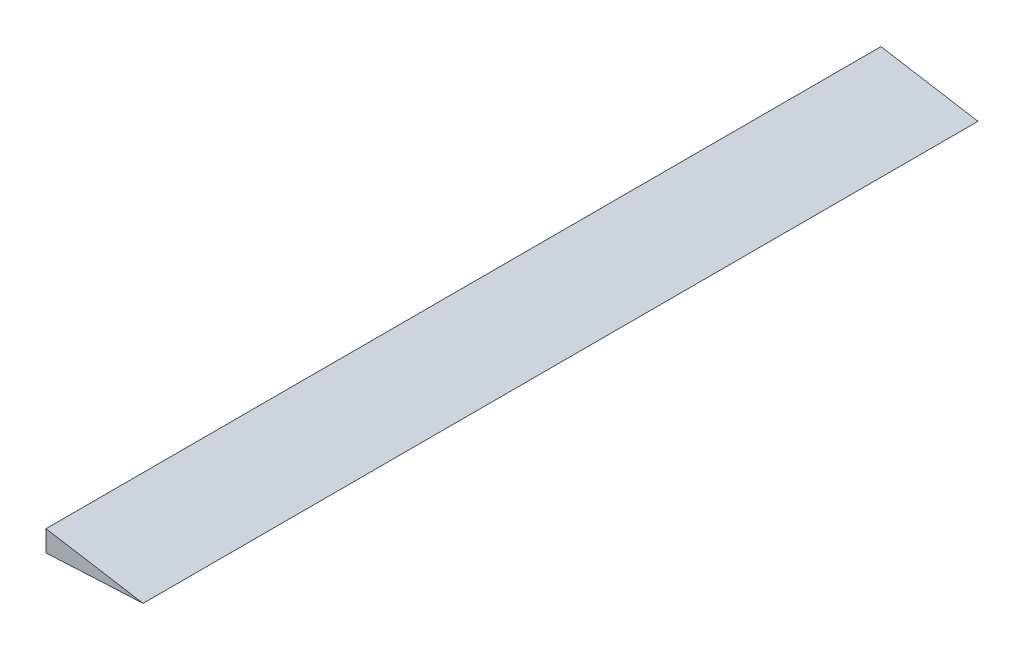
ISO-10303-21;
HEADER;
FILE_DESCRIPTION(('STEP AP214'),'2;1');
FILE_NAME('part.step','',(''),(''),'','','');
FILE_SCHEMA(('AUTOMOTIVE_DESIGN { 1 0 10303 214 1 1 1 1 }'));
ENDSEC;
DATA;
#1=APPLICATION_CONTEXT('core data for automotive mechanical design processes');
#2=APPLICATION_PROTOCOL_DEFINITION('international standard','automotive_design',2000,#1);
#3=PRODUCT_CONTEXT('',#1,'mechanical');
#4=PRODUCT('Part','Part','',(#3));
#5=PRODUCT_RELATED_PRODUCT_CATEGORY('part','',(#4));
#6=PRODUCT_DEFINITION_FORMATION('','',#4);
#7=PRODUCT_DEFINITION_CONTEXT('part definition',#1,'design');
#8=PRODUCT_DEFINITION('design','',#6,#7);
#9=PRODUCT_DEFINITION_SHAPE('','',#8);
#10=(LENGTH_UNIT() NAMED_UNIT(*) SI_UNIT(.MILLI.,.METRE.));
#11=(NAMED_UNIT(*) PLANE_ANGLE_UNIT() SI_UNIT($,.RADIAN.));
#12=(NAMED_UNIT(*) SI_UNIT($,.STERADIAN.) SOLID_ANGLE_UNIT());
#13=UNCERTAINTY_MEASURE_WITH_UNIT(LENGTH_MEASURE(1.E-05),#10,'distance_accuracy_value','');
#14=(GEOMETRIC_REPRESENTATION_CONTEXT(3) GLOBAL_UNCERTAINTY_ASSIGNED_CONTEXT((#13)) GLOBAL_UNIT_ASSIGNED_CONTEXT((#10,
#11,#12)) REPRESENTATION_CONTEXT('',''));
#15=CARTESIAN_POINT('',(0.,0.,0.));
#16=DIRECTION('',(0.,0.,1.));
#17=DIRECTION('',(1.,0.,0.));
#18=AXIS2_PLACEMENT_3D('',#15,#16,#17);
#19=CARTESIAN_POINT('',(306.849576799999,-2.51611574111238,-324.977506));
#20=DIRECTION('',(0.0494691955585382,-0.998775649828725,0.));
#21=DIRECTION('',(0.998775649828725,0.0494691955585382,0.));
#22=AXIS2_PLACEMENT_3D('',#19,#20,#21);
#23=PLANE('',#22);
#24=DIRECTION('',(-0.998775649828725,-0.0494691955585382,0.));
#25=VECTOR('',#24,1.);
#26=CARTESIAN_POINT('',(306.849576799999,-2.51611574111238,-761.999746));
#27=LINE('',#26,#25);
#28=CARTESIAN_POINT('',(357.6495768,0.,-761.999746));
#29=VERTEX_POINT('',#28);
#30=CARTESIAN_POINT('',(306.849576799999,-2.51611574111238,-761.999746));
#31=VERTEX_POINT('',#30);
#32=EDGE_CURVE('E97',#29,#31,#27,.T.);
#33=ORIENTED_EDGE('',*,*,#32,.F.);
#34=DIRECTION('',(0.,0.,-1.));
#35=VECTOR('',#34,1.);
#36=CARTESIAN_POINT('',(357.6495768,0.,-324.977506));
#37=LINE('',#36,#35);
#38=CARTESIAN_POINT('',(357.6495768,0.,-324.977506));
#39=VERTEX_POINT('',#38);
#40=EDGE_CURVE('E11',#39,#29,#37,.T.);
#41=ORIENTED_EDGE('',*,*,#40,.F.);
#42=DIRECTION('',(-0.998775649828725,-0.0494691955585382,0.));
#43=VECTOR('',#42,1.);
#44=CARTESIAN_POINT('',(306.849576799999,-2.51611574111238,-324.977506));
#45=LINE('',#44,#43);
#46=CARTESIAN_POINT('',(306.849576799999,-2.51611574111238,-324.977506));
#47=VERTEX_POINT('',#46);
#48=EDGE_CURVE('E85',#39,#47,#45,.T.);
#49=ORIENTED_EDGE('',*,*,#48,.T.);
#50=DIRECTION('',(0.,0.,-1.));
#51=VECTOR('',#50,1.);
#52=CARTESIAN_POINT('',(306.849576799999,-2.51611574111238,-324.977506));
#53=LINE('',#52,#51);
#54=EDGE_CURVE('E42',#47,#31,#53,.T.);
#55=ORIENTED_EDGE('',*,*,#54,.T.);
#56=EDGE_LOOP('',(#33,#41,#49,#55));
#57=FACE_BOUND('',#56,.T.);
#58=ADVANCED_FACE('F39',(#57),#23,.T.);
#59=CARTESIAN_POINT('',(306.8495768,8.44985600136988,-324.977506));
#60=DIRECTION('',(0.164081367708129,0.986446807877156,0.));
#61=DIRECTION('',(-0.986446807877156,0.164081367708129,0.));
#62=AXIS2_PLACEMENT_3D('',#59,#60,#61);
#63=PLANE('',#62);
#64=DIRECTION('',(0.986446807877156,-0.164081367708129,0.));
#65=VECTOR('',#64,1.);
#66=CARTESIAN_POINT('',(306.8495768,8.44985600136988,-761.999746));
#67=LINE('',#66,#65);
#68=CARTESIAN_POINT('',(306.8495768,8.44985600136988,-761.999746));
#69=VERTEX_POINT('',#68);
#70=EDGE_CURVE('E89',#69,#29,#67,.T.);
#71=ORIENTED_EDGE('',*,*,#70,.F.);
#72=DIRECTION('',(0.,0.,-1.));
#73=VECTOR('',#72,1.);
#74=CARTESIAN_POINT('',(306.8495768,8.44985600136988,-324.977506));
#75=LINE('',#74,#73);
#76=CARTESIAN_POINT('',(306.8495768,8.44985600136988,-324.977506));
#77=VERTEX_POINT('',#76);
#78=EDGE_CURVE('E49',#77,#69,#75,.T.);
#79=ORIENTED_EDGE('',*,*,#78,.F.);
#80=DIRECTION('',(0.986446807877156,-0.164081367708129,0.));
#81=VECTOR('',#80,1.);
#82=CARTESIAN_POINT('',(306.8495768,8.44985600136988,-324.977506));
#83=LINE('',#82,#81);
#84=EDGE_CURVE('E82',#77,#39,#83,.T.);
#85=ORIENTED_EDGE('',*,*,#84,.T.);
#86=ORIENTED_EDGE('',*,*,#40,.T.);
#87=EDGE_LOOP('',(#71,#79,#85,#86));
#88=FACE_BOUND('',#87,.T.);
#89=ADVANCED_FACE('F104',(#88),#63,.T.);
#90=CARTESIAN_POINT('',(306.849576799999,-2.51611574111238,-324.977506));
#91=DIRECTION('',(-1.,1.16428941119077E-13,0.));
#92=DIRECTION('',(-1.16428941119077E-13,-1.,0.));
#93=AXIS2_PLACEMENT_3D('',#90,#91,#92);
#94=PLANE('',#93);
#95=DIRECTION('',(1.16428941119077E-13,1.,0.));
#96=VECTOR('',#95,1.);
#97=CARTESIAN_POINT('',(306.849576799999,-2.51611574111238,-761.999746));
#98=LINE('',#97,#96);
#99=EDGE_CURVE('E79',#31,#69,#98,.T.);
#100=ORIENTED_EDGE('',*,*,#99,.F.);
#101=ORIENTED_EDGE('',*,*,#54,.F.);
#102=DIRECTION('',(1.16428941119077E-13,1.,0.));
#103=VECTOR('',#102,1.);
#104=CARTESIAN_POINT('',(306.849576799999,-2.51611574111238,-324.977506));
#105=LINE('',#104,#103);
#106=EDGE_CURVE('E77',#47,#77,#105,.T.);
#107=ORIENTED_EDGE('',*,*,#106,.T.);
#108=ORIENTED_EDGE('',*,*,#78,.T.);
#109=EDGE_LOOP('',(#100,#101,#107,#108));
#110=FACE_BOUND('',#109,.T.);
#111=ADVANCED_FACE('F76',(#110),#94,.T.);
#112=CARTESIAN_POINT('',(0.,0.,-324.977506));
#113=DIRECTION('',(0.,0.,1.));
#114=DIRECTION('',(1.,0.,0.));
#115=AXIS2_PLACEMENT_3D('',#112,#113,#114);
#116=PLANE('',#115);
#117=ORIENTED_EDGE('',*,*,#48,.F.);
#118=ORIENTED_EDGE('',*,*,#84,.F.);
#119=ORIENTED_EDGE('',*,*,#106,.F.);
#120=EDGE_LOOP('',(#117,#118,#119));
#121=FACE_BOUND('',#120,.T.);
#122=ADVANCED_FACE('F84',(#121),#116,.T.);
#123=CARTESIAN_POINT('',(0.,0.,-761.999746));
#124=DIRECTION('',(0.,0.,1.));
#125=DIRECTION('',(1.,0.,0.));
#126=AXIS2_PLACEMENT_3D('',#123,#124,#125);
#127=PLANE('',#126);
#128=ORIENTED_EDGE('',*,*,#32,.T.);
#129=ORIENTED_EDGE('',*,*,#99,.T.);
#130=ORIENTED_EDGE('',*,*,#70,.T.);
#131=EDGE_LOOP('',(#128,#129,#130));
#132=FACE_BOUND('',#131,.T.);
#133=ADVANCED_FACE('F103',(#132),#127,.F.);
#134=CLOSED_SHELL('',(#58,#89,#111,#122,#133));
#135=MANIFOLD_SOLID_BREP('B2',#134);
#136=ADVANCED_BREP_SHAPE_REPRESENTATION('',(#18,#135),#14);
#137=SHAPE_DEFINITION_REPRESENTATION(#9,#136);
ENDSEC;
END-ISO-10303-21;
